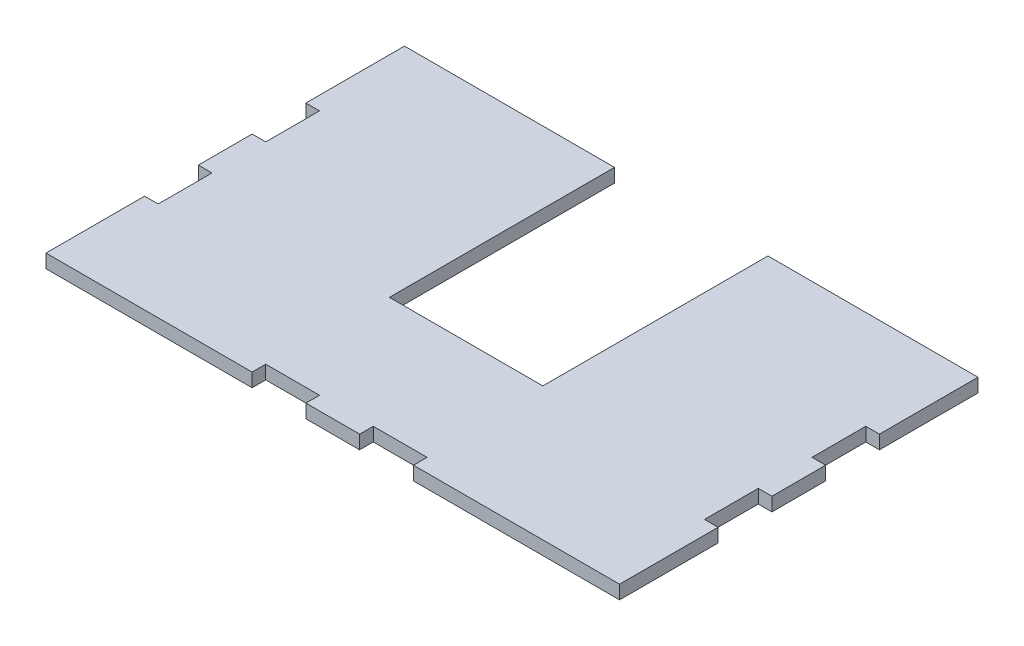
ISO-10303-21;
HEADER;
FILE_DESCRIPTION(('STEP AP214'),'2;1');
FILE_NAME('part.step','',(''),(''),'','','');
FILE_SCHEMA(('AUTOMOTIVE_DESIGN { 1 0 10303 214 1 1 1 1 }'));
ENDSEC;
DATA;
#1=APPLICATION_CONTEXT('core data for automotive mechanical design processes');
#2=APPLICATION_PROTOCOL_DEFINITION('international standard','automotive_design',2000,#1);
#3=PRODUCT_CONTEXT('',#1,'mechanical');
#4=PRODUCT('Part','Part','',(#3));
#5=PRODUCT_RELATED_PRODUCT_CATEGORY('part','',(#4));
#6=PRODUCT_DEFINITION_FORMATION('','',#4);
#7=PRODUCT_DEFINITION_CONTEXT('part definition',#1,'design');
#8=PRODUCT_DEFINITION('design','',#6,#7);
#9=PRODUCT_DEFINITION_SHAPE('','',#8);
#10=(LENGTH_UNIT() NAMED_UNIT(*) SI_UNIT(.MILLI.,.METRE.));
#11=(NAMED_UNIT(*) PLANE_ANGLE_UNIT() SI_UNIT($,.RADIAN.));
#12=(NAMED_UNIT(*) SI_UNIT($,.STERADIAN.) SOLID_ANGLE_UNIT());
#13=UNCERTAINTY_MEASURE_WITH_UNIT(LENGTH_MEASURE(1.E-05),#10,'distance_accuracy_value','');
#14=(GEOMETRIC_REPRESENTATION_CONTEXT(3) GLOBAL_UNCERTAINTY_ASSIGNED_CONTEXT((#13)) GLOBAL_UNIT_ASSIGNED_CONTEXT((#10,
#11,#12)) REPRESENTATION_CONTEXT('',''));
#15=CARTESIAN_POINT('',(0.,0.,0.));
#16=DIRECTION('',(0.,0.,1.));
#17=DIRECTION('',(1.,0.,0.));
#18=AXIS2_PLACEMENT_3D('',#15,#16,#17);
#19=CARTESIAN_POINT('',(0.,4.826,0.));
#20=DIRECTION('',(0.,0.,-1.));
#21=DIRECTION('',(-1.,0.,0.));
#22=AXIS2_PLACEMENT_3D('',#19,#20,#21);
#23=PLANE('',#22);
#24=DIRECTION('',(1.,0.,0.));
#25=VECTOR('',#24,1.);
#26=CARTESIAN_POINT('',(0.,0.,0.));
#27=LINE('',#26,#25);
#28=CARTESIAN_POINT('',(92.075,0.,0.));
#29=VERTEX_POINT('',#28);
#30=CARTESIAN_POINT('',(111.125,0.,0.));
#31=VERTEX_POINT('',#30);
#32=EDGE_CURVE('E258',#29,#31,#27,.T.);
#33=ORIENTED_EDGE('',*,*,#32,.T.);
#34=DIRECTION('',(0.,1.,0.));
#35=VECTOR('',#34,1.);
#36=CARTESIAN_POINT('',(111.125,0.,0.));
#37=LINE('',#36,#35);
#38=CARTESIAN_POINT('',(111.125,4.826,0.));
#39=VERTEX_POINT('',#38);
#40=EDGE_CURVE('E242',#31,#39,#37,.T.);
#41=ORIENTED_EDGE('',*,*,#40,.T.);
#42=DIRECTION('',(1.,0.,0.));
#43=VECTOR('',#42,1.);
#44=CARTESIAN_POINT('',(0.,4.826,0.));
#45=LINE('',#44,#43);
#46=CARTESIAN_POINT('',(92.075,4.826,0.));
#47=VERTEX_POINT('',#46);
#48=EDGE_CURVE('E297',#47,#39,#45,.T.);
#49=ORIENTED_EDGE('',*,*,#48,.F.);
#50=DIRECTION('',(0.,1.,0.));
#51=VECTOR('',#50,1.);
#52=CARTESIAN_POINT('',(92.075,0.,0.));
#53=LINE('',#52,#51);
#54=EDGE_CURVE('E264',#29,#47,#53,.T.);
#55=ORIENTED_EDGE('',*,*,#54,.F.);
#56=EDGE_LOOP('',(#33,#41,#49,#55));
#57=FACE_BOUND('',#56,.T.);
#58=ADVANCED_FACE('F33',(#57),#23,.F.);
#59=CARTESIAN_POINT('',(0.,0.,0.));
#60=VERTEX_POINT('',#59);
#61=CARTESIAN_POINT('',(73.025,0.,0.));
#62=VERTEX_POINT('',#61);
#63=EDGE_CURVE('E265',#60,#62,#27,.T.);
#64=ORIENTED_EDGE('',*,*,#63,.T.);
#65=DIRECTION('',(0.,1.,0.));
#66=VECTOR('',#65,1.);
#67=CARTESIAN_POINT('',(73.025,0.,0.));
#68=LINE('',#67,#66);
#69=CARTESIAN_POINT('',(73.025,4.826,0.));
#70=VERTEX_POINT('',#69);
#71=EDGE_CURVE('E324',#62,#70,#68,.T.);
#72=ORIENTED_EDGE('',*,*,#71,.T.);
#73=CARTESIAN_POINT('',(0.,4.826,0.));
#74=VERTEX_POINT('',#73);
#75=EDGE_CURVE('E291',#74,#70,#45,.T.);
#76=ORIENTED_EDGE('',*,*,#75,.F.);
#77=DIRECTION('',(0.,-1.,0.));
#78=VECTOR('',#77,1.);
#79=CARTESIAN_POINT('',(0.,4.826,0.));
#80=LINE('',#79,#78);
#81=EDGE_CURVE('E11',#74,#60,#80,.T.);
#82=ORIENTED_EDGE('',*,*,#81,.T.);
#83=EDGE_LOOP('',(#64,#72,#76,#82));
#84=FACE_BOUND('',#83,.T.);
#85=ADVANCED_FACE('F323',(#84),#23,.F.);
#86=CARTESIAN_POINT('',(203.2,4.826,0.));
#87=DIRECTION('',(-1.,0.,0.));
#88=DIRECTION('',(0.,0.,1.));
#89=AXIS2_PLACEMENT_3D('',#86,#87,#88);
#90=PLANE('',#89);
#91=DIRECTION('',(0.,0.,-1.));
#92=VECTOR('',#91,1.);
#93=CARTESIAN_POINT('',(203.2,0.,0.));
#94=LINE('',#93,#92);
#95=CARTESIAN_POINT('',(203.2,0.,-53.975));
#96=VERTEX_POINT('',#95);
#97=CARTESIAN_POINT('',(203.2,0.,-73.025));
#98=VERTEX_POINT('',#97);
#99=EDGE_CURVE('E277',#96,#98,#94,.T.);
#100=ORIENTED_EDGE('',*,*,#99,.T.);
#101=DIRECTION('',(0.,1.,0.));
#102=VECTOR('',#101,1.);
#103=CARTESIAN_POINT('',(203.2,0.,-73.025));
#104=LINE('',#103,#102);
#105=CARTESIAN_POINT('',(203.2,4.826,-73.025));
#106=VERTEX_POINT('',#105);
#107=EDGE_CURVE('E368',#98,#106,#104,.T.);
#108=ORIENTED_EDGE('',*,*,#107,.T.);
#109=DIRECTION('',(0.,0.,-1.));
#110=VECTOR('',#109,1.);
#111=CARTESIAN_POINT('',(203.2,4.826,0.));
#112=LINE('',#111,#110);
#113=CARTESIAN_POINT('',(203.2,4.826,-53.975));
#114=VERTEX_POINT('',#113);
#115=EDGE_CURVE('E285',#114,#106,#112,.T.);
#116=ORIENTED_EDGE('',*,*,#115,.F.);
#117=DIRECTION('',(0.,1.,0.));
#118=VECTOR('',#117,1.);
#119=CARTESIAN_POINT('',(203.2,0.,-53.975));
#120=LINE('',#119,#118);
#121=EDGE_CURVE('E405',#96,#114,#120,.T.);
#122=ORIENTED_EDGE('',*,*,#121,.F.);
#123=EDGE_LOOP('',(#100,#108,#116,#122));
#124=FACE_BOUND('',#123,.T.);
#125=ADVANCED_FACE('F545',(#124),#90,.F.);
#126=CARTESIAN_POINT('',(203.2,0.,0.));
#127=VERTEX_POINT('',#126);
#128=CARTESIAN_POINT('',(203.2,0.,-34.925));
#129=VERTEX_POINT('',#128);
#130=EDGE_CURVE('E274',#127,#129,#94,.T.);
#131=ORIENTED_EDGE('',*,*,#130,.T.);
#132=DIRECTION('',(0.,1.,0.));
#133=VECTOR('',#132,1.);
#134=CARTESIAN_POINT('',(203.2,0.,-34.925));
#135=LINE('',#134,#133);
#136=CARTESIAN_POINT('',(203.2,4.826,-34.925));
#137=VERTEX_POINT('',#136);
#138=EDGE_CURVE('E394',#129,#137,#135,.T.);
#139=ORIENTED_EDGE('',*,*,#138,.T.);
#140=CARTESIAN_POINT('',(203.2,4.826,0.));
#141=VERTEX_POINT('',#140);
#142=EDGE_CURVE('E279',#141,#137,#112,.T.);
#143=ORIENTED_EDGE('',*,*,#142,.F.);
#144=DIRECTION('',(0.,-1.,0.));
#145=VECTOR('',#144,1.);
#146=CARTESIAN_POINT('',(203.2,4.826,0.));
#147=LINE('',#146,#145);
#148=EDGE_CURVE('E41',#141,#127,#147,.T.);
#149=ORIENTED_EDGE('',*,*,#148,.T.);
#150=EDGE_LOOP('',(#131,#139,#143,#149));
#151=FACE_BOUND('',#150,.T.);
#152=ADVANCED_FACE('F555',(#151),#90,.F.);
#153=CARTESIAN_POINT('',(0.,4.826,0.));
#154=DIRECTION('',(1.,0.,0.));
#155=DIRECTION('',(0.,0.,-1.));
#156=AXIS2_PLACEMENT_3D('',#153,#154,#155);
#157=PLANE('',#156);
#158=DIRECTION('',(0.,0.,1.));
#159=VECTOR('',#158,1.);
#160=CARTESIAN_POINT('',(0.,0.,0.));
#161=LINE('',#160,#159);
#162=CARTESIAN_POINT('',(0.,0.,-73.025));
#163=VERTEX_POINT('',#162);
#164=CARTESIAN_POINT('',(0.,0.,-53.975));
#165=VERTEX_POINT('',#164);
#166=EDGE_CURVE('E330',#163,#165,#161,.T.);
#167=ORIENTED_EDGE('',*,*,#166,.T.);
#168=DIRECTION('',(0.,1.,0.));
#169=VECTOR('',#168,1.);
#170=CARTESIAN_POINT('',(0.,0.,-53.975));
#171=LINE('',#170,#169);
#172=CARTESIAN_POINT('',(0.,4.826,-53.975));
#173=VERTEX_POINT('',#172);
#174=EDGE_CURVE('E423',#165,#173,#171,.T.);
#175=ORIENTED_EDGE('',*,*,#174,.T.);
#176=DIRECTION('',(0.,0.,1.));
#177=VECTOR('',#176,1.);
#178=CARTESIAN_POINT('',(0.,4.826,0.));
#179=LINE('',#178,#177);
#180=CARTESIAN_POINT('',(0.,4.826,-73.025));
#181=VERTEX_POINT('',#180);
#182=EDGE_CURVE('E306',#181,#173,#179,.T.);
#183=ORIENTED_EDGE('',*,*,#182,.F.);
#184=DIRECTION('',(0.,1.,0.));
#185=VECTOR('',#184,1.);
#186=CARTESIAN_POINT('',(0.,0.,-73.025));
#187=LINE('',#186,#185);
#188=EDGE_CURVE('E442',#163,#181,#187,.T.);
#189=ORIENTED_EDGE('',*,*,#188,.F.);
#190=EDGE_LOOP('',(#167,#175,#183,#189));
#191=FACE_BOUND('',#190,.T.);
#192=ADVANCED_FACE('F519',(#191),#157,.F.);
#193=CARTESIAN_POINT('',(0.,0.,-127.));
#194=VERTEX_POINT('',#193);
#195=CARTESIAN_POINT('',(0.,0.,-92.075));
#196=VERTEX_POINT('',#195);
#197=EDGE_CURVE('E270',#194,#196,#161,.T.);
#198=ORIENTED_EDGE('',*,*,#197,.T.);
#199=DIRECTION('',(0.,1.,0.));
#200=VECTOR('',#199,1.);
#201=CARTESIAN_POINT('',(0.,0.,-92.075));
#202=LINE('',#201,#200);
#203=CARTESIAN_POINT('',(0.,4.826,-92.075));
#204=VERTEX_POINT('',#203);
#205=EDGE_CURVE('E449',#196,#204,#202,.T.);
#206=ORIENTED_EDGE('',*,*,#205,.T.);
#207=CARTESIAN_POINT('',(0.,4.826,-127.));
#208=VERTEX_POINT('',#207);
#209=EDGE_CURVE('E302',#208,#204,#179,.T.);
#210=ORIENTED_EDGE('',*,*,#209,.F.);
#211=DIRECTION('',(0.,1.,0.));
#212=VECTOR('',#211,1.);
#213=CARTESIAN_POINT('',(0.,0.,-127.));
#214=LINE('',#213,#212);
#215=EDGE_CURVE('E487',#194,#208,#214,.T.);
#216=ORIENTED_EDGE('',*,*,#215,.F.);
#217=EDGE_LOOP('',(#198,#206,#210,#216));
#218=FACE_BOUND('',#217,.T.);
#219=ADVANCED_FACE('F502',(#218),#157,.F.);
#220=CARTESIAN_POINT('',(0.,0.,-127.));
#221=DIRECTION('',(0.,0.,1.));
#222=DIRECTION('',(1.,0.,0.));
#223=AXIS2_PLACEMENT_3D('',#220,#221,#222);
#224=PLANE('',#223);
#225=DIRECTION('',(1.,0.,0.));
#226=VECTOR('',#225,1.);
#227=CARTESIAN_POINT('',(0.,4.826,-127.));
#228=LINE('',#227,#226);
#229=CARTESIAN_POINT('',(74.422,4.826,-127.));
#230=VERTEX_POINT('',#229);
#231=EDGE_CURVE('E489',#208,#230,#228,.T.);
#232=ORIENTED_EDGE('',*,*,#231,.T.);
#233=DIRECTION('',(0.,1.,0.));
#234=VECTOR('',#233,1.);
#235=CARTESIAN_POINT('',(74.422,0.,-127.));
#236=LINE('',#235,#234);
#237=CARTESIAN_POINT('',(74.422,0.,-127.));
#238=VERTEX_POINT('',#237);
#239=EDGE_CURVE('E475',#238,#230,#236,.T.);
#240=ORIENTED_EDGE('',*,*,#239,.F.);
#241=DIRECTION('',(1.,0.,0.));
#242=VECTOR('',#241,1.);
#243=CARTESIAN_POINT('',(0.,0.,-127.));
#244=LINE('',#243,#242);
#245=EDGE_CURVE('E484',#194,#238,#244,.T.);
#246=ORIENTED_EDGE('',*,*,#245,.F.);
#247=ORIENTED_EDGE('',*,*,#215,.T.);
#248=EDGE_LOOP('',(#232,#240,#246,#247));
#249=FACE_BOUND('',#248,.T.);
#250=ADVANCED_FACE('F495',(#249),#224,.F.);
#251=CARTESIAN_POINT('',(0.,4.826,-34.925));
#252=VERTEX_POINT('',#251);
#253=EDGE_CURVE('E276',#252,#74,#179,.T.);
#254=ORIENTED_EDGE('',*,*,#253,.F.);
#255=DIRECTION('',(0.,1.,0.));
#256=VECTOR('',#255,1.);
#257=CARTESIAN_POINT('',(0.,0.,-34.925));
#258=LINE('',#257,#256);
#259=CARTESIAN_POINT('',(0.,0.,-34.925));
#260=VERTEX_POINT('',#259);
#261=EDGE_CURVE('E328',#260,#252,#258,.T.);
#262=ORIENTED_EDGE('',*,*,#261,.F.);
#263=EDGE_CURVE('E326',#260,#60,#161,.T.);
#264=ORIENTED_EDGE('',*,*,#263,.T.);
#265=ORIENTED_EDGE('',*,*,#81,.F.);
#266=EDGE_LOOP('',(#254,#262,#264,#265));
#267=FACE_BOUND('',#266,.T.);
#268=ADVANCED_FACE('F35',(#267),#157,.F.);
#269=CARTESIAN_POINT('',(130.175,4.826,0.));
#270=VERTEX_POINT('',#269);
#271=EDGE_CURVE('E298',#270,#141,#45,.T.);
#272=ORIENTED_EDGE('',*,*,#271,.F.);
#273=DIRECTION('',(0.,1.,0.));
#274=VECTOR('',#273,1.);
#275=CARTESIAN_POINT('',(130.175,0.,0.));
#276=LINE('',#275,#274);
#277=CARTESIAN_POINT('',(130.175,0.,0.));
#278=VERTEX_POINT('',#277);
#279=EDGE_CURVE('E252',#278,#270,#276,.T.);
#280=ORIENTED_EDGE('',*,*,#279,.F.);
#281=EDGE_CURVE('E266',#278,#127,#27,.T.);
#282=ORIENTED_EDGE('',*,*,#281,.T.);
#283=ORIENTED_EDGE('',*,*,#148,.F.);
#284=EDGE_LOOP('',(#272,#280,#282,#283));
#285=FACE_BOUND('',#284,.T.);
#286=ADVANCED_FACE('F541',(#285),#23,.F.);
#287=CARTESIAN_POINT('',(203.2,4.826,-92.075));
#288=VERTEX_POINT('',#287);
#289=CARTESIAN_POINT('',(203.2,4.826,-127.));
#290=VERTEX_POINT('',#289);
#291=EDGE_CURVE('E286',#288,#290,#112,.T.);
#292=ORIENTED_EDGE('',*,*,#291,.F.);
#293=DIRECTION('',(0.,1.,0.));
#294=VECTOR('',#293,1.);
#295=CARTESIAN_POINT('',(203.2,0.,-92.075));
#296=LINE('',#295,#294);
#297=CARTESIAN_POINT('',(203.2,0.,-92.075));
#298=VERTEX_POINT('',#297);
#299=EDGE_CURVE('E380',#298,#288,#296,.T.);
#300=ORIENTED_EDGE('',*,*,#299,.F.);
#301=CARTESIAN_POINT('',(203.2,0.,-127.));
#302=VERTEX_POINT('',#301);
#303=EDGE_CURVE('E269',#298,#302,#94,.T.);
#304=ORIENTED_EDGE('',*,*,#303,.T.);
#305=DIRECTION('',(0.,1.,0.));
#306=VECTOR('',#305,1.);
#307=CARTESIAN_POINT('',(203.2,0.,-127.));
#308=LINE('',#307,#306);
#309=EDGE_CURVE('E331',#302,#290,#308,.T.);
#310=ORIENTED_EDGE('',*,*,#309,.T.);
#311=EDGE_LOOP('',(#292,#300,#304,#310));
#312=FACE_BOUND('',#311,.T.);
#313=ADVANCED_FACE('F548',(#312),#90,.F.);
#314=CARTESIAN_POINT('',(0.,4.826,0.));
#315=DIRECTION('',(0.,-1.,0.));
#316=DIRECTION('',(0.,0.,-1.));
#317=AXIS2_PLACEMENT_3D('',#314,#315,#316);
#318=PLANE('',#317);
#319=ORIENTED_EDGE('',*,*,#48,.T.);
#320=DIRECTION('',(0.,0.,1.));
#321=VECTOR('',#320,1.);
#322=CARTESIAN_POINT('',(111.125,4.826,0.));
#323=LINE('',#322,#321);
#324=CARTESIAN_POINT('',(111.125,4.826,-4.826));
#325=VERTEX_POINT('',#324);
#326=EDGE_CURVE('E247',#325,#39,#323,.T.);
#327=ORIENTED_EDGE('',*,*,#326,.F.);
#328=DIRECTION('',(-1.,0.,0.));
#329=VECTOR('',#328,1.);
#330=CARTESIAN_POINT('',(111.125,4.826,-4.826));
#331=LINE('',#330,#329);
#332=CARTESIAN_POINT('',(130.175,4.826,-4.826));
#333=VERTEX_POINT('',#332);
#334=EDGE_CURVE('E261',#333,#325,#331,.T.);
#335=ORIENTED_EDGE('',*,*,#334,.F.);
#336=DIRECTION('',(0.,0.,-1.));
#337=VECTOR('',#336,1.);
#338=CARTESIAN_POINT('',(130.175,4.826,0.));
#339=LINE('',#338,#337);
#340=EDGE_CURVE('E845',#270,#333,#339,.T.);
#341=ORIENTED_EDGE('',*,*,#340,.F.);
#342=ORIENTED_EDGE('',*,*,#271,.T.);
#343=ORIENTED_EDGE('',*,*,#142,.T.);
#344=DIRECTION('',(1.,0.,0.));
#345=VECTOR('',#344,1.);
#346=CARTESIAN_POINT('',(203.2,4.826,-34.925));
#347=LINE('',#346,#345);
#348=CARTESIAN_POINT('',(198.374,4.826,-34.925));
#349=VERTEX_POINT('',#348);
#350=EDGE_CURVE('E377',#349,#137,#347,.T.);
#351=ORIENTED_EDGE('',*,*,#350,.F.);
#352=DIRECTION('',(0.,0.,1.));
#353=VECTOR('',#352,1.);
#354=CARTESIAN_POINT('',(198.374,4.826,-53.975));
#355=LINE('',#354,#353);
#356=CARTESIAN_POINT('',(198.374,4.826,-53.975));
#357=VERTEX_POINT('',#356);
#358=EDGE_CURVE('E388',#357,#349,#355,.T.);
#359=ORIENTED_EDGE('',*,*,#358,.F.);
#360=DIRECTION('',(-1.,0.,0.));
#361=VECTOR('',#360,1.);
#362=CARTESIAN_POINT('',(203.2,4.826,-53.975));
#363=LINE('',#362,#361);
#364=EDGE_CURVE('E396',#114,#357,#363,.T.);
#365=ORIENTED_EDGE('',*,*,#364,.F.);
#366=ORIENTED_EDGE('',*,*,#115,.T.);
#367=DIRECTION('',(1.,0.,0.));
#368=VECTOR('',#367,1.);
#369=CARTESIAN_POINT('',(203.2,4.826,-73.025));
#370=LINE('',#369,#368);
#371=CARTESIAN_POINT('',(198.374,4.826,-73.025));
#372=VERTEX_POINT('',#371);
#373=EDGE_CURVE('E353',#372,#106,#370,.T.);
#374=ORIENTED_EDGE('',*,*,#373,.F.);
#375=DIRECTION('',(0.,0.,1.));
#376=VECTOR('',#375,1.);
#377=CARTESIAN_POINT('',(198.374,4.826,-92.075));
#378=LINE('',#377,#376);
#379=CARTESIAN_POINT('',(198.374,4.826,-92.075));
#380=VERTEX_POINT('',#379);
#381=EDGE_CURVE('E362',#380,#372,#378,.T.);
#382=ORIENTED_EDGE('',*,*,#381,.F.);
#383=DIRECTION('',(-1.,0.,0.));
#384=VECTOR('',#383,1.);
#385=CARTESIAN_POINT('',(203.2,4.826,-92.075));
#386=LINE('',#385,#384);
#387=EDGE_CURVE('E370',#288,#380,#386,.T.);
#388=ORIENTED_EDGE('',*,*,#387,.F.);
#389=ORIENTED_EDGE('',*,*,#291,.T.);
#390=CARTESIAN_POINT('',(128.778,4.826,-127.));
#391=VERTEX_POINT('',#390);
#392=EDGE_CURVE('E477',#391,#290,#228,.T.);
#393=ORIENTED_EDGE('',*,*,#392,.F.);
#394=DIRECTION('',(0.,0.,-1.));
#395=VECTOR('',#394,1.);
#396=CARTESIAN_POINT('',(128.778,4.826,-127.));
#397=LINE('',#396,#395);
#398=CARTESIAN_POINT('',(128.778,4.826,-47.244));
#399=VERTEX_POINT('',#398);
#400=EDGE_CURVE('E462',#399,#391,#397,.T.);
#401=ORIENTED_EDGE('',*,*,#400,.F.);
#402=DIRECTION('',(1.,0.,0.));
#403=VECTOR('',#402,1.);
#404=CARTESIAN_POINT('',(74.422,4.826,-47.244));
#405=LINE('',#404,#403);
#406=CARTESIAN_POINT('',(74.422,4.826,-47.244));
#407=VERTEX_POINT('',#406);
#408=EDGE_CURVE('E471',#407,#399,#405,.T.);
#409=ORIENTED_EDGE('',*,*,#408,.F.);
#410=DIRECTION('',(0.,0.,1.));
#411=VECTOR('',#410,1.);
#412=CARTESIAN_POINT('',(74.422,4.826,-127.));
#413=LINE('',#412,#411);
#414=EDGE_CURVE('E452',#230,#407,#413,.T.);
#415=ORIENTED_EDGE('',*,*,#414,.F.);
#416=ORIENTED_EDGE('',*,*,#231,.F.);
#417=ORIENTED_EDGE('',*,*,#209,.T.);
#418=DIRECTION('',(-1.,0.,0.));
#419=VECTOR('',#418,1.);
#420=CARTESIAN_POINT('',(0.,4.826,-92.075));
#421=LINE('',#420,#419);
#422=CARTESIAN_POINT('',(4.82600000000001,4.826,-92.075));
#423=VERTEX_POINT('',#422);
#424=EDGE_CURVE('E436',#423,#204,#421,.T.);
#425=ORIENTED_EDGE('',*,*,#424,.F.);
#426=DIRECTION('',(0.,0.,-1.));
#427=VECTOR('',#426,1.);
#428=CARTESIAN_POINT('',(4.82600000000001,4.826,-92.075));
#429=LINE('',#428,#427);
#430=CARTESIAN_POINT('',(4.82600000000001,4.826,-73.025));
#431=VERTEX_POINT('',#430);
#432=EDGE_CURVE('E445',#431,#423,#429,.T.);
#433=ORIENTED_EDGE('',*,*,#432,.F.);
#434=DIRECTION('',(1.,0.,0.));
#435=VECTOR('',#434,1.);
#436=CARTESIAN_POINT('',(0.,4.826,-73.025));
#437=LINE('',#436,#435);
#438=EDGE_CURVE('E426',#181,#431,#437,.T.);
#439=ORIENTED_EDGE('',*,*,#438,.F.);
#440=ORIENTED_EDGE('',*,*,#182,.T.);
#441=DIRECTION('',(-1.,0.,0.));
#442=VECTOR('',#441,1.);
#443=CARTESIAN_POINT('',(0.,4.826,-53.975));
#444=LINE('',#443,#442);
#445=CARTESIAN_POINT('',(4.82600000000001,4.826,-53.975));
#446=VERTEX_POINT('',#445);
#447=EDGE_CURVE('E412',#446,#173,#444,.T.);
#448=ORIENTED_EDGE('',*,*,#447,.F.);
#449=DIRECTION('',(0.,0.,-1.));
#450=VECTOR('',#449,1.);
#451=CARTESIAN_POINT('',(4.82600000000001,4.826,-53.975));
#452=LINE('',#451,#450);
#453=CARTESIAN_POINT('',(4.82600000000001,4.826,-34.925));
#454=VERTEX_POINT('',#453);
#455=EDGE_CURVE('E419',#454,#446,#452,.T.);
#456=ORIENTED_EDGE('',*,*,#455,.F.);
#457=DIRECTION('',(1.,0.,0.));
#458=VECTOR('',#457,1.);
#459=CARTESIAN_POINT('',(0.,4.826,-34.925));
#460=LINE('',#459,#458);
#461=EDGE_CURVE('E317',#252,#454,#460,.T.);
#462=ORIENTED_EDGE('',*,*,#461,.F.);
#463=ORIENTED_EDGE('',*,*,#253,.T.);
#464=ORIENTED_EDGE('',*,*,#75,.T.);
#465=DIRECTION('',(0.,0.,1.));
#466=VECTOR('',#465,1.);
#467=CARTESIAN_POINT('',(73.025,4.826,0.));
#468=LINE('',#467,#466);
#469=CARTESIAN_POINT('',(73.025,4.826,-4.826));
#470=VERTEX_POINT('',#469);
#471=EDGE_CURVE('E346',#470,#70,#468,.T.);
#472=ORIENTED_EDGE('',*,*,#471,.F.);
#473=DIRECTION('',(-1.,0.,0.));
#474=VECTOR('',#473,1.);
#475=CARTESIAN_POINT('',(73.025,4.826,-4.826));
#476=LINE('',#475,#474);
#477=CARTESIAN_POINT('',(92.075,4.826,-4.826));
#478=VERTEX_POINT('',#477);
#479=EDGE_CURVE('E337',#478,#470,#476,.T.);
#480=ORIENTED_EDGE('',*,*,#479,.F.);
#481=DIRECTION('',(0.,0.,-1.));
#482=VECTOR('',#481,1.);
#483=CARTESIAN_POINT('',(92.075,4.826,0.));
#484=LINE('',#483,#482);
#485=EDGE_CURVE('E341',#47,#478,#484,.T.);
#486=ORIENTED_EDGE('',*,*,#485,.F.);
#487=EDGE_LOOP('',(#319,#327,#335,#341,#342,#343,#351,#359,#365,#366,#374,#382,#388,#389,#393,
#401,#409,#415,#416,#417,#425,#433,#439,#440,#448,#456,#462,#463,#464,#472,#480,#486));
#488=FACE_BOUND('',#487,.T.);
#489=ADVANCED_FACE('F314',(#488),#318,.F.);
#490=CARTESIAN_POINT('',(0.,0.,0.));
#491=DIRECTION('',(0.,-1.,0.));
#492=DIRECTION('',(0.,0.,-1.));
#493=AXIS2_PLACEMENT_3D('',#490,#491,#492);
#494=PLANE('',#493);
#495=DIRECTION('',(0.,0.,1.));
#496=VECTOR('',#495,1.);
#497=CARTESIAN_POINT('',(111.125,0.,0.));
#498=LINE('',#497,#496);
#499=CARTESIAN_POINT('',(111.125,0.,-4.826));
#500=VERTEX_POINT('',#499);
#501=EDGE_CURVE('E245',#500,#31,#498,.T.);
#502=ORIENTED_EDGE('',*,*,#501,.T.);
#503=ORIENTED_EDGE('',*,*,#32,.F.);
#504=DIRECTION('',(0.,0.,-1.));
#505=VECTOR('',#504,1.);
#506=CARTESIAN_POINT('',(92.075,0.,0.));
#507=LINE('',#506,#505);
#508=CARTESIAN_POINT('',(92.075,0.,-4.826));
#509=VERTEX_POINT('',#508);
#510=EDGE_CURVE('E336',#29,#509,#507,.T.);
#511=ORIENTED_EDGE('',*,*,#510,.T.);
#512=DIRECTION('',(-1.,0.,0.));
#513=VECTOR('',#512,1.);
#514=CARTESIAN_POINT('',(73.025,0.,-4.826));
#515=LINE('',#514,#513);
#516=CARTESIAN_POINT('',(73.025,0.,-4.826));
#517=VERTEX_POINT('',#516);
#518=EDGE_CURVE('E56',#509,#517,#515,.T.);
#519=ORIENTED_EDGE('',*,*,#518,.T.);
#520=DIRECTION('',(0.,0.,1.));
#521=VECTOR('',#520,1.);
#522=CARTESIAN_POINT('',(73.025,0.,0.));
#523=LINE('',#522,#521);
#524=EDGE_CURVE('E334',#517,#62,#523,.T.);
#525=ORIENTED_EDGE('',*,*,#524,.T.);
#526=ORIENTED_EDGE('',*,*,#63,.F.);
#527=ORIENTED_EDGE('',*,*,#263,.F.);
#528=DIRECTION('',(1.,0.,0.));
#529=VECTOR('',#528,1.);
#530=CARTESIAN_POINT('',(0.,0.,-34.925));
#531=LINE('',#530,#529);
#532=CARTESIAN_POINT('',(4.82600000000001,0.,-34.925));
#533=VERTEX_POINT('',#532);
#534=EDGE_CURVE('E409',#260,#533,#531,.T.);
#535=ORIENTED_EDGE('',*,*,#534,.T.);
#536=DIRECTION('',(0.,0.,-1.));
#537=VECTOR('',#536,1.);
#538=CARTESIAN_POINT('',(4.82600000000001,0.,-53.975));
#539=LINE('',#538,#537);
#540=CARTESIAN_POINT('',(4.82600000000001,0.,-53.975));
#541=VERTEX_POINT('',#540);
#542=EDGE_CURVE('E411',#533,#541,#539,.T.);
#543=ORIENTED_EDGE('',*,*,#542,.T.);
#544=DIRECTION('',(-1.,0.,0.));
#545=VECTOR('',#544,1.);
#546=CARTESIAN_POINT('',(0.,0.,-53.975));
#547=LINE('',#546,#545);
#548=EDGE_CURVE('E415',#541,#165,#547,.T.);
#549=ORIENTED_EDGE('',*,*,#548,.T.);
#550=ORIENTED_EDGE('',*,*,#166,.F.);
#551=DIRECTION('',(1.,0.,0.));
#552=VECTOR('',#551,1.);
#553=CARTESIAN_POINT('',(0.,0.,-73.025));
#554=LINE('',#553,#552);
#555=CARTESIAN_POINT('',(4.82600000000001,0.,-73.025));
#556=VERTEX_POINT('',#555);
#557=EDGE_CURVE('E432',#163,#556,#554,.T.);
#558=ORIENTED_EDGE('',*,*,#557,.T.);
#559=DIRECTION('',(0.,0.,-1.));
#560=VECTOR('',#559,1.);
#561=CARTESIAN_POINT('',(4.82600000000001,0.,-92.075));
#562=LINE('',#561,#560);
#563=CARTESIAN_POINT('',(4.82600000000001,0.,-92.075));
#564=VERTEX_POINT('',#563);
#565=EDGE_CURVE('E435',#556,#564,#562,.T.);
#566=ORIENTED_EDGE('',*,*,#565,.T.);
#567=DIRECTION('',(-1.,0.,0.));
#568=VECTOR('',#567,1.);
#569=CARTESIAN_POINT('',(0.,0.,-92.075));
#570=LINE('',#569,#568);
#571=EDGE_CURVE('E439',#564,#196,#570,.T.);
#572=ORIENTED_EDGE('',*,*,#571,.T.);
#573=ORIENTED_EDGE('',*,*,#197,.F.);
#574=ORIENTED_EDGE('',*,*,#245,.T.);
#575=DIRECTION('',(0.,0.,1.));
#576=VECTOR('',#575,1.);
#577=CARTESIAN_POINT('',(74.422,0.,-127.));
#578=LINE('',#577,#576);
#579=CARTESIAN_POINT('',(74.422,0.,-47.244));
#580=VERTEX_POINT('',#579);
#581=EDGE_CURVE('E458',#238,#580,#578,.T.);
#582=ORIENTED_EDGE('',*,*,#581,.T.);
#583=DIRECTION('',(1.,0.,0.));
#584=VECTOR('',#583,1.);
#585=CARTESIAN_POINT('',(74.422,0.,-47.244));
#586=LINE('',#585,#584);
#587=CARTESIAN_POINT('',(128.778,0.,-47.244));
#588=VERTEX_POINT('',#587);
#589=EDGE_CURVE('E461',#580,#588,#586,.T.);
#590=ORIENTED_EDGE('',*,*,#589,.T.);
#591=DIRECTION('',(0.,0.,-1.));
#592=VECTOR('',#591,1.);
#593=CARTESIAN_POINT('',(128.778,0.,-127.));
#594=LINE('',#593,#592);
#595=CARTESIAN_POINT('',(128.778,0.,-127.));
#596=VERTEX_POINT('',#595);
#597=EDGE_CURVE('E465',#588,#596,#594,.T.);
#598=ORIENTED_EDGE('',*,*,#597,.T.);
#599=EDGE_CURVE('E488',#596,#302,#244,.T.);
#600=ORIENTED_EDGE('',*,*,#599,.T.);
#601=ORIENTED_EDGE('',*,*,#303,.F.);
#602=DIRECTION('',(-1.,0.,0.));
#603=VECTOR('',#602,1.);
#604=CARTESIAN_POINT('',(203.2,0.,-92.075));
#605=LINE('',#604,#603);
#606=CARTESIAN_POINT('',(198.374,0.,-92.075));
#607=VERTEX_POINT('',#606);
#608=EDGE_CURVE('E361',#298,#607,#605,.T.);
#609=ORIENTED_EDGE('',*,*,#608,.T.);
#610=DIRECTION('',(0.,0.,1.));
#611=VECTOR('',#610,1.);
#612=CARTESIAN_POINT('',(198.374,0.,-92.075));
#613=LINE('',#612,#611);
#614=CARTESIAN_POINT('',(198.374,0.,-73.025));
#615=VERTEX_POINT('',#614);
#616=EDGE_CURVE('E365',#607,#615,#613,.T.);
#617=ORIENTED_EDGE('',*,*,#616,.T.);
#618=DIRECTION('',(1.,0.,0.));
#619=VECTOR('',#618,1.);
#620=CARTESIAN_POINT('',(203.2,0.,-73.025));
#621=LINE('',#620,#619);
#622=EDGE_CURVE('E358',#615,#98,#621,.T.);
#623=ORIENTED_EDGE('',*,*,#622,.T.);
#624=ORIENTED_EDGE('',*,*,#99,.F.);
#625=DIRECTION('',(-1.,0.,0.));
#626=VECTOR('',#625,1.);
#627=CARTESIAN_POINT('',(203.2,0.,-53.975));
#628=LINE('',#627,#626);
#629=CARTESIAN_POINT('',(198.374,0.,-53.975));
#630=VERTEX_POINT('',#629);
#631=EDGE_CURVE('E387',#96,#630,#628,.T.);
#632=ORIENTED_EDGE('',*,*,#631,.T.);
#633=DIRECTION('',(0.,0.,1.));
#634=VECTOR('',#633,1.);
#635=CARTESIAN_POINT('',(198.374,0.,-53.975));
#636=LINE('',#635,#634);
#637=CARTESIAN_POINT('',(198.374,0.,-34.925));
#638=VERTEX_POINT('',#637);
#639=EDGE_CURVE('E391',#630,#638,#636,.T.);
#640=ORIENTED_EDGE('',*,*,#639,.T.);
#641=DIRECTION('',(1.,0.,0.));
#642=VECTOR('',#641,1.);
#643=CARTESIAN_POINT('',(203.2,0.,-34.925));
#644=LINE('',#643,#642);
#645=EDGE_CURVE('E384',#638,#129,#644,.T.);
#646=ORIENTED_EDGE('',*,*,#645,.T.);
#647=ORIENTED_EDGE('',*,*,#130,.F.);
#648=ORIENTED_EDGE('',*,*,#281,.F.);
#649=DIRECTION('',(0.,0.,-1.));
#650=VECTOR('',#649,1.);
#651=CARTESIAN_POINT('',(130.175,0.,0.));
#652=LINE('',#651,#650);
#653=CARTESIAN_POINT('',(130.175,0.,-4.826));
#654=VERTEX_POINT('',#653);
#655=EDGE_CURVE('E260',#278,#654,#652,.T.);
#656=ORIENTED_EDGE('',*,*,#655,.T.);
#657=DIRECTION('',(-1.,0.,0.));
#658=VECTOR('',#657,1.);
#659=CARTESIAN_POINT('',(111.125,0.,-4.826));
#660=LINE('',#659,#658);
#661=EDGE_CURVE('E48',#654,#500,#660,.T.);
#662=ORIENTED_EDGE('',*,*,#661,.T.);
#663=EDGE_LOOP('',(#502,#503,#511,#519,#525,#526,#527,#535,#543,#549,#550,#558,#566,#572,#573,
#574,#582,#590,#598,#600,#601,#609,#617,#623,#624,#632,#640,#646,#647,#648,#656,#662));
#664=FACE_BOUND('',#663,.T.);
#665=ADVANCED_FACE('F256',(#664),#494,.T.);
#666=ORIENTED_EDGE('',*,*,#599,.F.);
#667=DIRECTION('',(0.,1.,0.));
#668=VECTOR('',#667,1.);
#669=CARTESIAN_POINT('',(128.778,0.,-127.));
#670=LINE('',#669,#668);
#671=EDGE_CURVE('E478',#596,#391,#670,.T.);
#672=ORIENTED_EDGE('',*,*,#671,.T.);
#673=ORIENTED_EDGE('',*,*,#392,.T.);
#674=ORIENTED_EDGE('',*,*,#309,.F.);
#675=EDGE_LOOP('',(#666,#672,#673,#674));
#676=FACE_BOUND('',#675,.T.);
#677=ADVANCED_FACE('F586',(#676),#224,.F.);
#678=CARTESIAN_POINT('',(74.422,0.,-127.));
#679=DIRECTION('',(-1.,0.,0.));
#680=DIRECTION('',(0.,0.,1.));
#681=AXIS2_PLACEMENT_3D('',#678,#679,#680);
#682=PLANE('',#681);
#683=ORIENTED_EDGE('',*,*,#414,.T.);
#684=DIRECTION('',(0.,1.,0.));
#685=VECTOR('',#684,1.);
#686=CARTESIAN_POINT('',(74.422,0.,-47.244));
#687=LINE('',#686,#685);
#688=EDGE_CURVE('E468',#580,#407,#687,.T.);
#689=ORIENTED_EDGE('',*,*,#688,.F.);
#690=ORIENTED_EDGE('',*,*,#581,.F.);
#691=ORIENTED_EDGE('',*,*,#239,.T.);
#692=EDGE_LOOP('',(#683,#689,#690,#691));
#693=FACE_BOUND('',#692,.T.);
#694=ADVANCED_FACE('F595',(#693),#682,.F.);
#695=CARTESIAN_POINT('',(128.778,0.,-127.));
#696=DIRECTION('',(1.,0.,0.));
#697=DIRECTION('',(0.,0.,-1.));
#698=AXIS2_PLACEMENT_3D('',#695,#696,#697);
#699=PLANE('',#698);
#700=ORIENTED_EDGE('',*,*,#400,.T.);
#701=ORIENTED_EDGE('',*,*,#671,.F.);
#702=ORIENTED_EDGE('',*,*,#597,.F.);
#703=DIRECTION('',(0.,1.,0.));
#704=VECTOR('',#703,1.);
#705=CARTESIAN_POINT('',(128.778,0.,-47.244));
#706=LINE('',#705,#704);
#707=EDGE_CURVE('E481',#588,#399,#706,.T.);
#708=ORIENTED_EDGE('',*,*,#707,.T.);
#709=EDGE_LOOP('',(#700,#701,#702,#708));
#710=FACE_BOUND('',#709,.T.);
#711=ADVANCED_FACE('F589',(#710),#699,.F.);
#712=CARTESIAN_POINT('',(74.422,0.,-47.244));
#713=DIRECTION('',(0.,0.,1.));
#714=DIRECTION('',(1.,0.,0.));
#715=AXIS2_PLACEMENT_3D('',#712,#713,#714);
#716=PLANE('',#715);
#717=ORIENTED_EDGE('',*,*,#408,.T.);
#718=ORIENTED_EDGE('',*,*,#707,.F.);
#719=ORIENTED_EDGE('',*,*,#589,.F.);
#720=ORIENTED_EDGE('',*,*,#688,.T.);
#721=EDGE_LOOP('',(#717,#718,#719,#720));
#722=FACE_BOUND('',#721,.T.);
#723=ADVANCED_FACE('F593',(#722),#716,.F.);
#724=CARTESIAN_POINT('',(0.,0.,-92.075));
#725=DIRECTION('',(0.,0.,-1.));
#726=DIRECTION('',(-1.,0.,0.));
#727=AXIS2_PLACEMENT_3D('',#724,#725,#726);
#728=PLANE('',#727);
#729=ORIENTED_EDGE('',*,*,#424,.T.);
#730=ORIENTED_EDGE('',*,*,#205,.F.);
#731=ORIENTED_EDGE('',*,*,#571,.F.);
#732=DIRECTION('',(0.,1.,0.));
#733=VECTOR('',#732,1.);
#734=CARTESIAN_POINT('',(4.82600000000001,0.,-92.075));
#735=LINE('',#734,#733);
#736=EDGE_CURVE('E453',#564,#423,#735,.T.);
#737=ORIENTED_EDGE('',*,*,#736,.T.);
#738=EDGE_LOOP('',(#729,#730,#731,#737));
#739=FACE_BOUND('',#738,.T.);
#740=ADVANCED_FACE('F505',(#739),#728,.F.);
#741=CARTESIAN_POINT('',(4.82600000000001,0.,-92.075));
#742=DIRECTION('',(1.,0.,0.));
#743=DIRECTION('',(0.,0.,-1.));
#744=AXIS2_PLACEMENT_3D('',#741,#742,#743);
#745=PLANE('',#744);
#746=ORIENTED_EDGE('',*,*,#432,.T.);
#747=ORIENTED_EDGE('',*,*,#736,.F.);
#748=ORIENTED_EDGE('',*,*,#565,.F.);
#749=DIRECTION('',(0.,1.,0.));
#750=VECTOR('',#749,1.);
#751=CARTESIAN_POINT('',(4.82600000000001,0.,-73.025));
#752=LINE('',#751,#750);
#753=EDGE_CURVE('E455',#556,#431,#752,.T.);
#754=ORIENTED_EDGE('',*,*,#753,.T.);
#755=EDGE_LOOP('',(#746,#747,#748,#754));
#756=FACE_BOUND('',#755,.T.);
#757=ADVANCED_FACE('F509',(#756),#745,.F.);
#758=CARTESIAN_POINT('',(0.,0.,-73.025));
#759=DIRECTION('',(0.,0.,1.));
#760=DIRECTION('',(1.,0.,0.));
#761=AXIS2_PLACEMENT_3D('',#758,#759,#760);
#762=PLANE('',#761);
#763=ORIENTED_EDGE('',*,*,#438,.T.);
#764=ORIENTED_EDGE('',*,*,#753,.F.);
#765=ORIENTED_EDGE('',*,*,#557,.F.);
#766=ORIENTED_EDGE('',*,*,#188,.T.);
#767=EDGE_LOOP('',(#763,#764,#765,#766));
#768=FACE_BOUND('',#767,.T.);
#769=ADVANCED_FACE('F511',(#768),#762,.F.);
#770=CARTESIAN_POINT('',(0.,0.,-53.975));
#771=DIRECTION('',(0.,0.,-1.));
#772=DIRECTION('',(-1.,0.,0.));
#773=AXIS2_PLACEMENT_3D('',#770,#771,#772);
#774=PLANE('',#773);
#775=ORIENTED_EDGE('',*,*,#447,.T.);
#776=ORIENTED_EDGE('',*,*,#174,.F.);
#777=ORIENTED_EDGE('',*,*,#548,.F.);
#778=DIRECTION('',(0.,1.,0.));
#779=VECTOR('',#778,1.);
#780=CARTESIAN_POINT('',(4.82600000000001,0.,-53.975));
#781=LINE('',#780,#779);
#782=EDGE_CURVE('E427',#541,#446,#781,.T.);
#783=ORIENTED_EDGE('',*,*,#782,.T.);
#784=EDGE_LOOP('',(#775,#776,#777,#783));
#785=FACE_BOUND('',#784,.T.);
#786=ADVANCED_FACE('F522',(#785),#774,.F.);
#787=CARTESIAN_POINT('',(4.82600000000001,0.,-53.975));
#788=DIRECTION('',(1.,0.,0.));
#789=DIRECTION('',(0.,0.,-1.));
#790=AXIS2_PLACEMENT_3D('',#787,#788,#789);
#791=PLANE('',#790);
#792=ORIENTED_EDGE('',*,*,#455,.T.);
#793=ORIENTED_EDGE('',*,*,#782,.F.);
#794=ORIENTED_EDGE('',*,*,#542,.F.);
#795=DIRECTION('',(0.,1.,0.));
#796=VECTOR('',#795,1.);
#797=CARTESIAN_POINT('',(4.82600000000001,0.,-34.925));
#798=LINE('',#797,#796);
#799=EDGE_CURVE('E429',#533,#454,#798,.T.);
#800=ORIENTED_EDGE('',*,*,#799,.T.);
#801=EDGE_LOOP('',(#792,#793,#794,#800));
#802=FACE_BOUND('',#801,.T.);
#803=ADVANCED_FACE('F525',(#802),#791,.F.);
#804=CARTESIAN_POINT('',(0.,0.,-34.925));
#805=DIRECTION('',(0.,0.,1.));
#806=DIRECTION('',(1.,0.,0.));
#807=AXIS2_PLACEMENT_3D('',#804,#805,#806);
#808=PLANE('',#807);
#809=ORIENTED_EDGE('',*,*,#461,.T.);
#810=ORIENTED_EDGE('',*,*,#799,.F.);
#811=ORIENTED_EDGE('',*,*,#534,.F.);
#812=ORIENTED_EDGE('',*,*,#261,.T.);
#813=EDGE_LOOP('',(#809,#810,#811,#812));
#814=FACE_BOUND('',#813,.T.);
#815=ADVANCED_FACE('F527',(#814),#808,.F.);
#816=CARTESIAN_POINT('',(203.2,0.,-34.925));
#817=DIRECTION('',(0.,0.,1.));
#818=DIRECTION('',(1.,0.,0.));
#819=AXIS2_PLACEMENT_3D('',#816,#817,#818);
#820=PLANE('',#819);
#821=ORIENTED_EDGE('',*,*,#350,.T.);
#822=ORIENTED_EDGE('',*,*,#138,.F.);
#823=ORIENTED_EDGE('',*,*,#645,.F.);
#824=DIRECTION('',(0.,1.,0.));
#825=VECTOR('',#824,1.);
#826=CARTESIAN_POINT('',(198.374,0.,-34.925));
#827=LINE('',#826,#825);
#828=EDGE_CURVE('E401',#638,#349,#827,.T.);
#829=ORIENTED_EDGE('',*,*,#828,.T.);
#830=EDGE_LOOP('',(#821,#822,#823,#829));
#831=FACE_BOUND('',#830,.T.);
#832=ADVANCED_FACE('F529',(#831),#820,.F.);
#833=CARTESIAN_POINT('',(198.374,0.,-53.975));
#834=DIRECTION('',(-1.,0.,0.));
#835=DIRECTION('',(0.,0.,1.));
#836=AXIS2_PLACEMENT_3D('',#833,#834,#835);
#837=PLANE('',#836);
#838=ORIENTED_EDGE('',*,*,#358,.T.);
#839=ORIENTED_EDGE('',*,*,#828,.F.);
#840=ORIENTED_EDGE('',*,*,#639,.F.);
#841=DIRECTION('',(0.,1.,0.));
#842=VECTOR('',#841,1.);
#843=CARTESIAN_POINT('',(198.374,0.,-53.975));
#844=LINE('',#843,#842);
#845=EDGE_CURVE('E403',#630,#357,#844,.T.);
#846=ORIENTED_EDGE('',*,*,#845,.T.);
#847=EDGE_LOOP('',(#838,#839,#840,#846));
#848=FACE_BOUND('',#847,.T.);
#849=ADVANCED_FACE('F535',(#848),#837,.F.);
#850=CARTESIAN_POINT('',(203.2,0.,-53.975));
#851=DIRECTION('',(0.,0.,-1.));
#852=DIRECTION('',(-1.,0.,0.));
#853=AXIS2_PLACEMENT_3D('',#850,#851,#852);
#854=PLANE('',#853);
#855=ORIENTED_EDGE('',*,*,#364,.T.);
#856=ORIENTED_EDGE('',*,*,#845,.F.);
#857=ORIENTED_EDGE('',*,*,#631,.F.);
#858=ORIENTED_EDGE('',*,*,#121,.T.);
#859=EDGE_LOOP('',(#855,#856,#857,#858));
#860=FACE_BOUND('',#859,.T.);
#861=ADVANCED_FACE('F563',(#860),#854,.F.);
#862=CARTESIAN_POINT('',(203.2,0.,-73.025));
#863=DIRECTION('',(0.,0.,1.));
#864=DIRECTION('',(1.,0.,0.));
#865=AXIS2_PLACEMENT_3D('',#862,#863,#864);
#866=PLANE('',#865);
#867=ORIENTED_EDGE('',*,*,#373,.T.);
#868=ORIENTED_EDGE('',*,*,#107,.F.);
#869=ORIENTED_EDGE('',*,*,#622,.F.);
#870=DIRECTION('',(0.,1.,0.));
#871=VECTOR('',#870,1.);
#872=CARTESIAN_POINT('',(198.374,0.,-73.025));
#873=LINE('',#872,#871);
#874=EDGE_CURVE('E375',#615,#372,#873,.T.);
#875=ORIENTED_EDGE('',*,*,#874,.T.);
#876=EDGE_LOOP('',(#867,#868,#869,#875));
#877=FACE_BOUND('',#876,.T.);
#878=ADVANCED_FACE('F573',(#877),#866,.F.);
#879=CARTESIAN_POINT('',(198.374,0.,-92.075));
#880=DIRECTION('',(-1.,0.,0.));
#881=DIRECTION('',(0.,0.,1.));
#882=AXIS2_PLACEMENT_3D('',#879,#880,#881);
#883=PLANE('',#882);
#884=ORIENTED_EDGE('',*,*,#381,.T.);
#885=ORIENTED_EDGE('',*,*,#874,.F.);
#886=ORIENTED_EDGE('',*,*,#616,.F.);
#887=DIRECTION('',(0.,1.,0.));
#888=VECTOR('',#887,1.);
#889=CARTESIAN_POINT('',(198.374,0.,-92.075));
#890=LINE('',#889,#888);
#891=EDGE_CURVE('E378',#607,#380,#890,.T.);
#892=ORIENTED_EDGE('',*,*,#891,.T.);
#893=EDGE_LOOP('',(#884,#885,#886,#892));
#894=FACE_BOUND('',#893,.T.);
#895=ADVANCED_FACE('F577',(#894),#883,.F.);
#896=CARTESIAN_POINT('',(203.2,0.,-92.075));
#897=DIRECTION('',(0.,0.,-1.));
#898=DIRECTION('',(-1.,0.,0.));
#899=AXIS2_PLACEMENT_3D('',#896,#897,#898);
#900=PLANE('',#899);
#901=ORIENTED_EDGE('',*,*,#387,.T.);
#902=ORIENTED_EDGE('',*,*,#891,.F.);
#903=ORIENTED_EDGE('',*,*,#608,.F.);
#904=ORIENTED_EDGE('',*,*,#299,.T.);
#905=EDGE_LOOP('',(#901,#902,#903,#904));
#906=FACE_BOUND('',#905,.T.);
#907=ADVANCED_FACE('F579',(#906),#900,.F.);
#908=CARTESIAN_POINT('',(73.025,0.,0.));
#909=DIRECTION('',(-1.,0.,0.));
#910=DIRECTION('',(0.,0.,1.));
#911=AXIS2_PLACEMENT_3D('',#908,#909,#910);
#912=PLANE('',#911);
#913=ORIENTED_EDGE('',*,*,#471,.T.);
#914=ORIENTED_EDGE('',*,*,#71,.F.);
#915=ORIENTED_EDGE('',*,*,#524,.F.);
#916=DIRECTION('',(0.,1.,0.));
#917=VECTOR('',#916,1.);
#918=CARTESIAN_POINT('',(73.025,0.,-4.826));
#919=LINE('',#918,#917);
#920=EDGE_CURVE('E351',#517,#470,#919,.T.);
#921=ORIENTED_EDGE('',*,*,#920,.T.);
#922=EDGE_LOOP('',(#913,#914,#915,#921));
#923=FACE_BOUND('',#922,.T.);
#924=ADVANCED_FACE('F768',(#923),#912,.F.);
#925=CARTESIAN_POINT('',(73.025,0.,-4.826));
#926=DIRECTION('',(0.,0.,-1.));
#927=DIRECTION('',(-1.,0.,0.));
#928=AXIS2_PLACEMENT_3D('',#925,#926,#927);
#929=PLANE('',#928);
#930=ORIENTED_EDGE('',*,*,#479,.T.);
#931=ORIENTED_EDGE('',*,*,#920,.F.);
#932=ORIENTED_EDGE('',*,*,#518,.F.);
#933=DIRECTION('',(0.,1.,0.));
#934=VECTOR('',#933,1.);
#935=CARTESIAN_POINT('',(92.075,0.,-4.826));
#936=LINE('',#935,#934);
#937=EDGE_CURVE('E354',#509,#478,#936,.T.);
#938=ORIENTED_EDGE('',*,*,#937,.T.);
#939=EDGE_LOOP('',(#930,#931,#932,#938));
#940=FACE_BOUND('',#939,.T.);
#941=ADVANCED_FACE('F796',(#940),#929,.F.);
#942=CARTESIAN_POINT('',(92.075,0.,0.));
#943=DIRECTION('',(1.,0.,0.));
#944=DIRECTION('',(0.,0.,-1.));
#945=AXIS2_PLACEMENT_3D('',#942,#943,#944);
#946=PLANE('',#945);
#947=ORIENTED_EDGE('',*,*,#485,.T.);
#948=ORIENTED_EDGE('',*,*,#937,.F.);
#949=ORIENTED_EDGE('',*,*,#510,.F.);
#950=ORIENTED_EDGE('',*,*,#54,.T.);
#951=EDGE_LOOP('',(#947,#948,#949,#950));
#952=FACE_BOUND('',#951,.T.);
#953=ADVANCED_FACE('F804',(#952),#946,.F.);
#954=CARTESIAN_POINT('',(111.125,0.,0.));
#955=DIRECTION('',(-1.,0.,0.));
#956=DIRECTION('',(0.,0.,1.));
#957=AXIS2_PLACEMENT_3D('',#954,#955,#956);
#958=PLANE('',#957);
#959=ORIENTED_EDGE('',*,*,#326,.T.);
#960=ORIENTED_EDGE('',*,*,#40,.F.);
#961=ORIENTED_EDGE('',*,*,#501,.F.);
#962=DIRECTION('',(0.,1.,0.));
#963=VECTOR('',#962,1.);
#964=CARTESIAN_POINT('',(111.125,0.,-4.826));
#965=LINE('',#964,#963);
#966=EDGE_CURVE('E348',#500,#325,#965,.T.);
#967=ORIENTED_EDGE('',*,*,#966,.T.);
#968=EDGE_LOOP('',(#959,#960,#961,#967));
#969=FACE_BOUND('',#968,.T.);
#970=ADVANCED_FACE('F244',(#969),#958,.F.);
#971=CARTESIAN_POINT('',(111.125,0.,-4.826));
#972=DIRECTION('',(0.,0.,-1.));
#973=DIRECTION('',(-1.,0.,0.));
#974=AXIS2_PLACEMENT_3D('',#971,#972,#973);
#975=PLANE('',#974);
#976=ORIENTED_EDGE('',*,*,#334,.T.);
#977=ORIENTED_EDGE('',*,*,#966,.F.);
#978=ORIENTED_EDGE('',*,*,#661,.F.);
#979=DIRECTION('',(0.,1.,0.));
#980=VECTOR('',#979,1.);
#981=CARTESIAN_POINT('',(130.175,0.,-4.826));
#982=LINE('',#981,#980);
#983=EDGE_CURVE('E847',#654,#333,#982,.T.);
#984=ORIENTED_EDGE('',*,*,#983,.T.);
#985=EDGE_LOOP('',(#976,#977,#978,#984));
#986=FACE_BOUND('',#985,.T.);
#987=ADVANCED_FACE('F820',(#986),#975,.F.);
#988=CARTESIAN_POINT('',(130.175,0.,0.));
#989=DIRECTION('',(1.,0.,0.));
#990=DIRECTION('',(0.,0.,-1.));
#991=AXIS2_PLACEMENT_3D('',#988,#989,#990);
#992=PLANE('',#991);
#993=ORIENTED_EDGE('',*,*,#340,.T.);
#994=ORIENTED_EDGE('',*,*,#983,.F.);
#995=ORIENTED_EDGE('',*,*,#655,.F.);
#996=ORIENTED_EDGE('',*,*,#279,.T.);
#997=EDGE_LOOP('',(#993,#994,#995,#996));
#998=FACE_BOUND('',#997,.T.);
#999=ADVANCED_FACE('F828',(#998),#992,.F.);
#1000=CLOSED_SHELL('',(#58,#85,#125,#152,#192,#219,#250,#268,#286,#313,#489,#665,#677,#694,#711,
#723,#740,#757,#769,#786,#803,#815,#832,#849,#861,#878,#895,#907,#924,#941,#953,#970,#987,#999));
#1001=MANIFOLD_SOLID_BREP('B2',#1000);
#1002=ADVANCED_BREP_SHAPE_REPRESENTATION('',(#18,#1001),#14);
#1003=SHAPE_DEFINITION_REPRESENTATION(#9,#1002);
ENDSEC;
END-ISO-10303-21;
